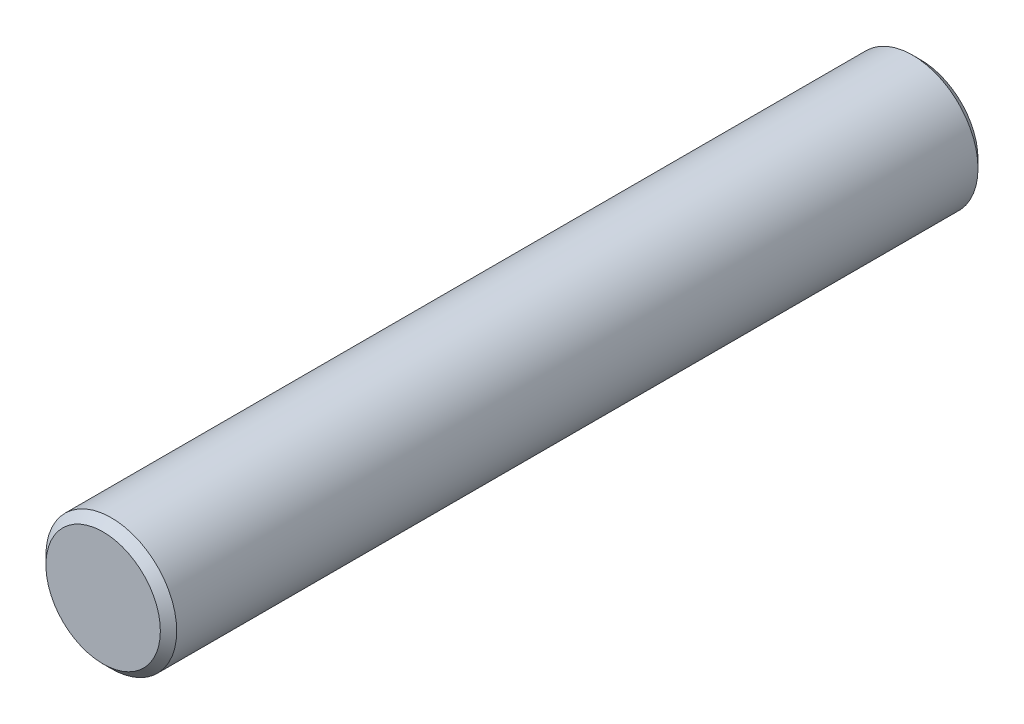
ISO-10303-21;
HEADER;
FILE_DESCRIPTION(('STEP AP214'),'2;1');
FILE_NAME('part.step','',(''),(''),'','','');
FILE_SCHEMA(('AUTOMOTIVE_DESIGN { 1 0 10303 214 1 1 1 1 }'));
ENDSEC;
DATA;
#1=APPLICATION_CONTEXT('core data for automotive mechanical design processes');
#2=APPLICATION_PROTOCOL_DEFINITION('international standard','automotive_design',2000,#1);
#3=PRODUCT_CONTEXT('',#1,'mechanical');
#4=PRODUCT('Part','Part','',(#3));
#5=PRODUCT_RELATED_PRODUCT_CATEGORY('part','',(#4));
#6=PRODUCT_DEFINITION_FORMATION('','',#4);
#7=PRODUCT_DEFINITION_CONTEXT('part definition',#1,'design');
#8=PRODUCT_DEFINITION('design','',#6,#7);
#9=PRODUCT_DEFINITION_SHAPE('','',#8);
#10=(LENGTH_UNIT() NAMED_UNIT(*) SI_UNIT(.MILLI.,.METRE.));
#11=(NAMED_UNIT(*) PLANE_ANGLE_UNIT() SI_UNIT($,.RADIAN.));
#12=(NAMED_UNIT(*) SI_UNIT($,.STERADIAN.) SOLID_ANGLE_UNIT());
#13=UNCERTAINTY_MEASURE_WITH_UNIT(LENGTH_MEASURE(1.E-05),#10,'distance_accuracy_value','');
#14=(GEOMETRIC_REPRESENTATION_CONTEXT(3) GLOBAL_UNCERTAINTY_ASSIGNED_CONTEXT((#13)) GLOBAL_UNIT_ASSIGNED_CONTEXT((#10,
#11,#12)) REPRESENTATION_CONTEXT('',''));
#15=CARTESIAN_POINT('',(0.,0.,0.));
#16=DIRECTION('',(0.,0.,1.));
#17=DIRECTION('',(1.,0.,0.));
#18=AXIS2_PLACEMENT_3D('',#15,#16,#17);
#19=CARTESIAN_POINT('',(0.,0.,-50.));
#20=DIRECTION('',(0.,0.,1.));
#21=DIRECTION('',(1.,0.,0.));
#22=AXIS2_PLACEMENT_3D('',#19,#20,#21);
#23=CYLINDRICAL_SURFACE('',#22,4.);
#24=CARTESIAN_POINT('',(0.,0.,-49.5));
#25=DIRECTION('',(0.,0.,1.));
#26=DIRECTION('',(1.,0.,0.));
#27=AXIS2_PLACEMENT_3D('',#24,#25,#26);
#28=CIRCLE('',#27,4.);
#29=CARTESIAN_POINT('',(4.,0.,-49.5));
#30=VERTEX_POINT('',#29);
#31=EDGE_CURVE('E53',#30,#30,#28,.T.);
#32=ORIENTED_EDGE('',*,*,#31,.T.);
#33=EDGE_LOOP('',(#32));
#34=FACE_BOUND('',#33,.T.);
#35=CARTESIAN_POINT('',(0.,0.,-0.500000000000014));
#36=DIRECTION('',(0.,0.,1.));
#37=DIRECTION('',(1.,0.,0.));
#38=AXIS2_PLACEMENT_3D('',#35,#36,#37);
#39=CIRCLE('',#38,4.);
#40=CARTESIAN_POINT('',(4.,0.,-0.500000000000014));
#41=VERTEX_POINT('',#40);
#42=EDGE_CURVE('E58',#41,#41,#39,.F.);
#43=ORIENTED_EDGE('',*,*,#42,.T.);
#44=EDGE_LOOP('',(#43));
#45=FACE_BOUND('',#44,.T.);
#46=ADVANCED_FACE('F39',(#34,#45),#23,.T.);
#47=CARTESIAN_POINT('',(0.,0.,-50.));
#48=DIRECTION('',(0.,0.,1.));
#49=DIRECTION('',(1.,0.,0.));
#50=AXIS2_PLACEMENT_3D('',#47,#48,#49);
#51=PLANE('',#50);
#52=CARTESIAN_POINT('',(0.,0.,-50.));
#53=DIRECTION('',(0.,0.,1.));
#54=DIRECTION('',(1.,0.,0.));
#55=AXIS2_PLACEMENT_3D('',#52,#53,#54);
#56=CIRCLE('',#55,3.50000000000001);
#57=CARTESIAN_POINT('',(3.50000000000001,0.,-50.));
#58=VERTEX_POINT('',#57);
#59=EDGE_CURVE('E48',#58,#58,#56,.F.);
#60=ORIENTED_EDGE('',*,*,#59,.T.);
#61=EDGE_LOOP('',(#60));
#62=FACE_BOUND('',#61,.T.);
#63=ADVANCED_FACE('F75',(#62),#51,.F.);
#64=CARTESIAN_POINT('',(0.,0.,0.));
#65=DIRECTION('',(0.,0.,1.));
#66=DIRECTION('',(1.,0.,0.));
#67=AXIS2_PLACEMENT_3D('',#64,#65,#66);
#68=PLANE('',#67);
#69=CARTESIAN_POINT('',(0.,0.,0.));
#70=DIRECTION('',(0.,0.,1.));
#71=DIRECTION('',(1.,0.,0.));
#72=AXIS2_PLACEMENT_3D('',#69,#70,#71);
#73=CIRCLE('',#72,3.49999999999999);
#74=CARTESIAN_POINT('',(3.49999999999999,0.,0.));
#75=VERTEX_POINT('',#74);
#76=EDGE_CURVE('E10',#75,#75,#73,.T.);
#77=ORIENTED_EDGE('',*,*,#76,.T.);
#78=EDGE_LOOP('',(#77));
#79=FACE_BOUND('',#78,.T.);
#80=ADVANCED_FACE('F72',(#79),#68,.T.);
#81=CARTESIAN_POINT('',(0.,0.,-49.5));
#82=DIRECTION('',(0.,0.,1.));
#83=DIRECTION('',(1.,0.,0.));
#84=AXIS2_PLACEMENT_3D('',#81,#82,#83);
#85=CONICAL_SURFACE('',#84,4.,0.785398163397438);
#86=ORIENTED_EDGE('',*,*,#59,.F.);
#87=EDGE_LOOP('',(#86));
#88=FACE_BOUND('',#87,.T.);
#89=ORIENTED_EDGE('',*,*,#31,.F.);
#90=EDGE_LOOP('',(#89));
#91=FACE_BOUND('',#90,.T.);
#92=ADVANCED_FACE('F68',(#88,#91),#85,.T.);
#93=CARTESIAN_POINT('',(0.,0.,0.));
#94=DIRECTION('',(0.,0.,-1.));
#95=DIRECTION('',(-1.,0.,0.));
#96=AXIS2_PLACEMENT_3D('',#93,#94,#95);
#97=CONICAL_SURFACE('',#96,3.49999999999999,0.785398163397445);
#98=ORIENTED_EDGE('',*,*,#42,.F.);
#99=EDGE_LOOP('',(#98));
#100=FACE_BOUND('',#99,.T.);
#101=ORIENTED_EDGE('',*,*,#76,.F.);
#102=EDGE_LOOP('',(#101));
#103=FACE_BOUND('',#102,.T.);
#104=ADVANCED_FACE('F42',(#100,#103),#97,.T.);
#105=CLOSED_SHELL('',(#46,#63,#80,#92,#104));
#106=MANIFOLD_SOLID_BREP('B2',#105);
#107=ADVANCED_BREP_SHAPE_REPRESENTATION('',(#18,#106),#14);
#108=SHAPE_DEFINITION_REPRESENTATION(#9,#107);
ENDSEC;
END-ISO-10303-21;
